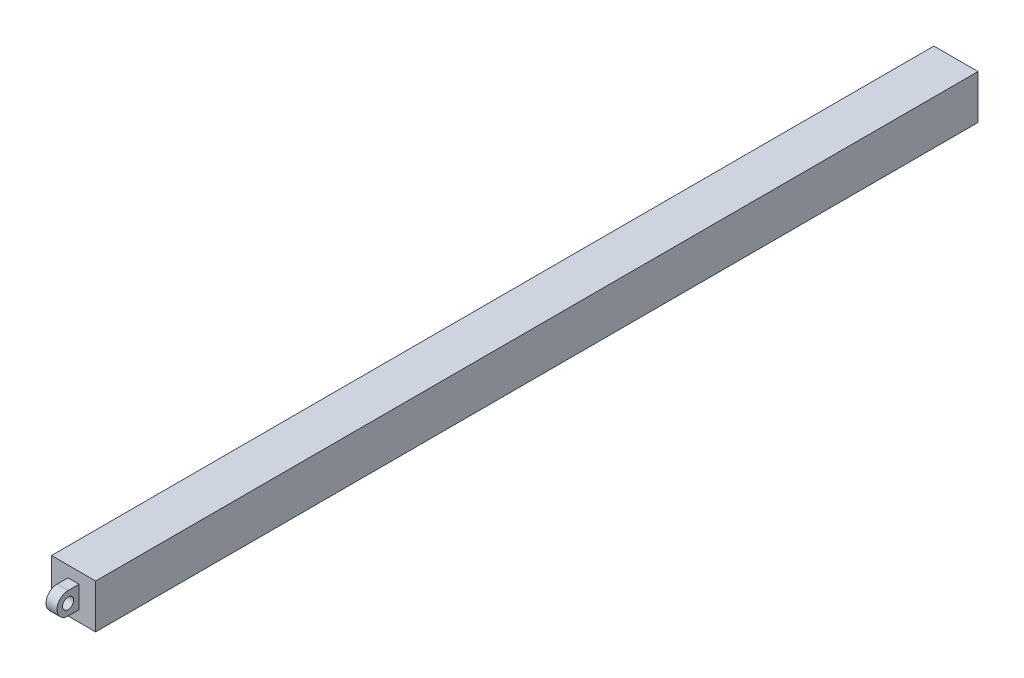
ISO-10303-21;
HEADER;
FILE_DESCRIPTION(('STEP AP214'),'2;1');
FILE_NAME('part.step','',(''),(''),'','','');
FILE_SCHEMA(('AUTOMOTIVE_DESIGN { 1 0 10303 214 1 1 1 1 }'));
ENDSEC;
DATA;
#1=APPLICATION_CONTEXT('core data for automotive mechanical design processes');
#2=APPLICATION_PROTOCOL_DEFINITION('international standard','automotive_design',2000,#1);
#3=PRODUCT_CONTEXT('',#1,'mechanical');
#4=PRODUCT('Part','Part','',(#3));
#5=PRODUCT_RELATED_PRODUCT_CATEGORY('part','',(#4));
#6=PRODUCT_DEFINITION_FORMATION('','',#4);
#7=PRODUCT_DEFINITION_CONTEXT('part definition',#1,'design');
#8=PRODUCT_DEFINITION('design','',#6,#7);
#9=PRODUCT_DEFINITION_SHAPE('','',#8);
#10=(LENGTH_UNIT() NAMED_UNIT(*) SI_UNIT(.MILLI.,.METRE.));
#11=(NAMED_UNIT(*) PLANE_ANGLE_UNIT() SI_UNIT($,.RADIAN.));
#12=(NAMED_UNIT(*) SI_UNIT($,.STERADIAN.) SOLID_ANGLE_UNIT());
#13=UNCERTAINTY_MEASURE_WITH_UNIT(LENGTH_MEASURE(1.E-05),#10,'distance_accuracy_value','');
#14=(GEOMETRIC_REPRESENTATION_CONTEXT(3) GLOBAL_UNCERTAINTY_ASSIGNED_CONTEXT((#13)) GLOBAL_UNIT_ASSIGNED_CONTEXT((#10,
#11,#12)) REPRESENTATION_CONTEXT('',''));
#15=CARTESIAN_POINT('',(0.,0.,0.));
#16=DIRECTION('',(0.,0.,1.));
#17=DIRECTION('',(1.,0.,0.));
#18=AXIS2_PLACEMENT_3D('',#15,#16,#17);
#19=CARTESIAN_POINT('',(5.,5.00000000000002,100.));
#20=DIRECTION('',(0.,0.,-1.));
#21=DIRECTION('',(-1.,0.,0.));
#22=AXIS2_PLACEMENT_3D('',#19,#20,#21);
#23=PLANE('',#22);
#24=DIRECTION('',(0.,-1.,0.));
#25=VECTOR('',#24,1.);
#26=CARTESIAN_POINT('',(-5.,5.00000000000002,100.));
#27=LINE('',#26,#25);
#28=CARTESIAN_POINT('',(-5.,5.00000000000002,100.));
#29=VERTEX_POINT('',#28);
#30=CARTESIAN_POINT('',(-5.,-5.00000000000002,100.));
#31=VERTEX_POINT('',#30);
#32=EDGE_CURVE('E121',#29,#31,#27,.T.);
#33=ORIENTED_EDGE('',*,*,#32,.T.);
#34=DIRECTION('',(-1.,0.,0.));
#35=VECTOR('',#34,1.);
#36=CARTESIAN_POINT('',(5.,-5.00000000000002,100.));
#37=LINE('',#36,#35);
#38=CARTESIAN_POINT('',(5.,-5.00000000000002,100.));
#39=VERTEX_POINT('',#38);
#40=EDGE_CURVE('E11',#39,#31,#37,.T.);
#41=ORIENTED_EDGE('',*,*,#40,.F.);
#42=DIRECTION('',(0.,-1.,0.));
#43=VECTOR('',#42,1.);
#44=CARTESIAN_POINT('',(5.,5.00000000000002,100.));
#45=LINE('',#44,#43);
#46=CARTESIAN_POINT('',(5.,5.00000000000002,100.));
#47=VERTEX_POINT('',#46);
#48=EDGE_CURVE('E130',#47,#39,#45,.T.);
#49=ORIENTED_EDGE('',*,*,#48,.F.);
#50=DIRECTION('',(-1.,0.,0.));
#51=VECTOR('',#50,1.);
#52=CARTESIAN_POINT('',(5.,5.00000000000002,100.));
#53=LINE('',#52,#51);
#54=EDGE_CURVE('E139',#47,#29,#53,.T.);
#55=ORIENTED_EDGE('',*,*,#54,.T.);
#56=EDGE_LOOP('',(#33,#41,#49,#55));
#57=FACE_BOUND('',#56,.T.);
#58=DIRECTION('',(-1.,0.,0.));
#59=VECTOR('',#58,1.);
#60=CARTESIAN_POINT('',(1.25,-2.50000000000001,100.));
#61=LINE('',#60,#59);
#62=CARTESIAN_POINT('',(1.25,-2.50000000000001,100.));
#63=VERTEX_POINT('',#62);
#64=CARTESIAN_POINT('',(-1.25,-2.50000000000001,100.));
#65=VERTEX_POINT('',#64);
#66=EDGE_CURVE('E56',#63,#65,#61,.T.);
#67=ORIENTED_EDGE('',*,*,#66,.T.);
#68=DIRECTION('',(0.,1.,0.));
#69=VECTOR('',#68,1.);
#70=CARTESIAN_POINT('',(-1.25,2.49999999999999,100.));
#71=LINE('',#70,#69);
#72=CARTESIAN_POINT('',(-1.25,2.49999999999999,100.));
#73=VERTEX_POINT('',#72);
#74=EDGE_CURVE('E220',#65,#73,#71,.T.);
#75=ORIENTED_EDGE('',*,*,#74,.T.);
#76=DIRECTION('',(-1.,0.,0.));
#77=VECTOR('',#76,1.);
#78=CARTESIAN_POINT('',(1.25,2.49999999999999,100.));
#79=LINE('',#78,#77);
#80=CARTESIAN_POINT('',(1.25,2.49999999999999,100.));
#81=VERTEX_POINT('',#80);
#82=EDGE_CURVE('E126',#81,#73,#79,.T.);
#83=ORIENTED_EDGE('',*,*,#82,.F.);
#84=DIRECTION('',(0.,1.,0.));
#85=VECTOR('',#84,1.);
#86=CARTESIAN_POINT('',(1.25,2.49999999999999,100.));
#87=LINE('',#86,#85);
#88=EDGE_CURVE('E51',#63,#81,#87,.T.);
#89=ORIENTED_EDGE('',*,*,#88,.F.);
#90=EDGE_LOOP('',(#67,#75,#83,#89));
#91=FACE_BOUND('',#90,.T.);
#92=ADVANCED_FACE('F37',(#57,#91),#23,.F.);
#93=CARTESIAN_POINT('',(5.,-5.00000000000002,100.));
#94=DIRECTION('',(0.,1.,0.));
#95=DIRECTION('',(0.,0.,1.));
#96=AXIS2_PLACEMENT_3D('',#93,#94,#95);
#97=PLANE('',#96);
#98=DIRECTION('',(0.,0.,-1.));
#99=VECTOR('',#98,1.);
#100=CARTESIAN_POINT('',(-5.,-5.00000000000002,100.));
#101=LINE('',#100,#99);
#102=CARTESIAN_POINT('',(-5.,-5.,-100.));
#103=VERTEX_POINT('',#102);
#104=EDGE_CURVE('E124',#31,#103,#101,.T.);
#105=ORIENTED_EDGE('',*,*,#104,.T.);
#106=DIRECTION('',(-1.,0.,0.));
#107=VECTOR('',#106,1.);
#108=CARTESIAN_POINT('',(5.,-5.,-100.));
#109=LINE('',#108,#107);
#110=CARTESIAN_POINT('',(5.,-5.,-100.));
#111=VERTEX_POINT('',#110);
#112=EDGE_CURVE('E44',#111,#103,#109,.T.);
#113=ORIENTED_EDGE('',*,*,#112,.F.);
#114=DIRECTION('',(0.,0.,-1.));
#115=VECTOR('',#114,1.);
#116=CARTESIAN_POINT('',(5.,-5.00000000000002,100.));
#117=LINE('',#116,#115);
#118=EDGE_CURVE('E133',#39,#111,#117,.T.);
#119=ORIENTED_EDGE('',*,*,#118,.F.);
#120=ORIENTED_EDGE('',*,*,#40,.T.);
#121=EDGE_LOOP('',(#105,#113,#119,#120));
#122=FACE_BOUND('',#121,.T.);
#123=ADVANCED_FACE('F170',(#122),#97,.F.);
#124=CARTESIAN_POINT('',(5.,5.,-100.));
#125=DIRECTION('',(0.,0.,1.));
#126=DIRECTION('',(1.,0.,0.));
#127=AXIS2_PLACEMENT_3D('',#124,#125,#126);
#128=PLANE('',#127);
#129=DIRECTION('',(0.,1.,0.));
#130=VECTOR('',#129,1.);
#131=CARTESIAN_POINT('',(-5.,5.,-100.));
#132=LINE('',#131,#130);
#133=CARTESIAN_POINT('',(-5.,5.,-100.));
#134=VERTEX_POINT('',#133);
#135=EDGE_CURVE('E142',#103,#134,#132,.T.);
#136=ORIENTED_EDGE('',*,*,#135,.T.);
#137=DIRECTION('',(-1.,0.,0.));
#138=VECTOR('',#137,1.);
#139=CARTESIAN_POINT('',(5.,5.,-100.));
#140=LINE('',#139,#138);
#141=CARTESIAN_POINT('',(5.,5.,-100.));
#142=VERTEX_POINT('',#141);
#143=EDGE_CURVE('E147',#142,#134,#140,.T.);
#144=ORIENTED_EDGE('',*,*,#143,.F.);
#145=DIRECTION('',(0.,1.,0.));
#146=VECTOR('',#145,1.);
#147=CARTESIAN_POINT('',(5.,5.,-100.));
#148=LINE('',#147,#146);
#149=EDGE_CURVE('E136',#111,#142,#148,.T.);
#150=ORIENTED_EDGE('',*,*,#149,.F.);
#151=ORIENTED_EDGE('',*,*,#112,.T.);
#152=EDGE_LOOP('',(#136,#144,#150,#151));
#153=FACE_BOUND('',#152,.T.);
#154=ADVANCED_FACE('F154',(#153),#128,.F.);
#155=CARTESIAN_POINT('',(5.,5.00000000000002,100.));
#156=DIRECTION('',(0.,-1.,0.));
#157=DIRECTION('',(0.,0.,-1.));
#158=AXIS2_PLACEMENT_3D('',#155,#156,#157);
#159=PLANE('',#158);
#160=DIRECTION('',(0.,0.,1.));
#161=VECTOR('',#160,1.);
#162=CARTESIAN_POINT('',(-5.,5.00000000000002,100.));
#163=LINE('',#162,#161);
#164=EDGE_CURVE('E134',#134,#29,#163,.T.);
#165=ORIENTED_EDGE('',*,*,#164,.T.);
#166=ORIENTED_EDGE('',*,*,#54,.F.);
#167=DIRECTION('',(0.,0.,1.));
#168=VECTOR('',#167,1.);
#169=CARTESIAN_POINT('',(5.,5.00000000000002,100.));
#170=LINE('',#169,#168);
#171=EDGE_CURVE('E138',#142,#47,#170,.T.);
#172=ORIENTED_EDGE('',*,*,#171,.F.);
#173=ORIENTED_EDGE('',*,*,#143,.T.);
#174=EDGE_LOOP('',(#165,#166,#172,#173));
#175=FACE_BOUND('',#174,.T.);
#176=ADVANCED_FACE('F163',(#175),#159,.F.);
#177=CARTESIAN_POINT('',(5.,0.,0.));
#178=DIRECTION('',(1.,0.,0.));
#179=DIRECTION('',(0.,0.,-1.));
#180=AXIS2_PLACEMENT_3D('',#177,#178,#179);
#181=PLANE('',#180);
#182=ORIENTED_EDGE('',*,*,#48,.T.);
#183=ORIENTED_EDGE('',*,*,#118,.T.);
#184=ORIENTED_EDGE('',*,*,#149,.T.);
#185=ORIENTED_EDGE('',*,*,#171,.T.);
#186=EDGE_LOOP('',(#182,#183,#184,#185));
#187=FACE_BOUND('',#186,.T.);
#188=ADVANCED_FACE('F169',(#187),#181,.T.);
#189=CARTESIAN_POINT('',(-5.,0.,0.));
#190=DIRECTION('',(1.,0.,0.));
#191=DIRECTION('',(0.,0.,-1.));
#192=AXIS2_PLACEMENT_3D('',#189,#190,#191);
#193=PLANE('',#192);
#194=ORIENTED_EDGE('',*,*,#32,.F.);
#195=ORIENTED_EDGE('',*,*,#164,.F.);
#196=ORIENTED_EDGE('',*,*,#135,.F.);
#197=ORIENTED_EDGE('',*,*,#104,.F.);
#198=EDGE_LOOP('',(#194,#195,#196,#197));
#199=FACE_BOUND('',#198,.T.);
#200=ADVANCED_FACE('F160',(#199),#193,.F.);
#201=CARTESIAN_POINT('',(1.25,0.,102.5));
#202=DIRECTION('',(1.,0.,0.));
#203=DIRECTION('',(0.,0.,-1.));
#204=AXIS2_PLACEMENT_3D('',#201,#202,#203);
#205=PLANE('',#204);
#206=CARTESIAN_POINT('',(1.25,0.,102.5));
#207=DIRECTION('',(1.,0.,0.));
#208=DIRECTION('',(0.,0.,-1.));
#209=AXIS2_PLACEMENT_3D('',#206,#207,#208);
#210=CIRCLE('',#209,2.5);
#211=CARTESIAN_POINT('',(1.25,2.5,102.5));
#212=VERTEX_POINT('',#211);
#213=CARTESIAN_POINT('',(1.25,-2.5,102.5));
#214=VERTEX_POINT('',#213);
#215=EDGE_CURVE('E106',#212,#214,#210,.T.);
#216=ORIENTED_EDGE('',*,*,#215,.T.);
#217=DIRECTION('',(0.,0.,-1.));
#218=VECTOR('',#217,1.);
#219=CARTESIAN_POINT('',(1.25,-2.5,102.5));
#220=LINE('',#219,#218);
#221=EDGE_CURVE('E99',#214,#63,#220,.T.);
#222=ORIENTED_EDGE('',*,*,#221,.T.);
#223=ORIENTED_EDGE('',*,*,#88,.T.);
#224=DIRECTION('',(0.,0.,1.));
#225=VECTOR('',#224,1.);
#226=CARTESIAN_POINT('',(1.25,2.5,102.5));
#227=LINE('',#226,#225);
#228=EDGE_CURVE('E112',#81,#212,#227,.T.);
#229=ORIENTED_EDGE('',*,*,#228,.T.);
#230=EDGE_LOOP('',(#216,#222,#223,#229));
#231=FACE_BOUND('',#230,.T.);
#232=CARTESIAN_POINT('',(1.25,0.,102.5));
#233=DIRECTION('',(1.,0.,0.));
#234=DIRECTION('',(0.,0.,-1.));
#235=AXIS2_PLACEMENT_3D('',#232,#233,#234);
#236=CIRCLE('',#235,1.25);
#237=CARTESIAN_POINT('',(1.25,0.,101.25));
#238=VERTEX_POINT('',#237);
#239=EDGE_CURVE('E206',#238,#238,#236,.T.);
#240=ORIENTED_EDGE('',*,*,#239,.F.);
#241=EDGE_LOOP('',(#240));
#242=FACE_BOUND('',#241,.T.);
#243=ADVANCED_FACE('F109',(#231,#242),#205,.T.);
#244=CARTESIAN_POINT('',(-1.25,0.,102.5));
#245=DIRECTION('',(1.,0.,0.));
#246=DIRECTION('',(0.,0.,-1.));
#247=AXIS2_PLACEMENT_3D('',#244,#245,#246);
#248=PLANE('',#247);
#249=CARTESIAN_POINT('',(-1.25,0.,102.5));
#250=DIRECTION('',(1.,0.,0.));
#251=DIRECTION('',(0.,0.,-1.));
#252=AXIS2_PLACEMENT_3D('',#249,#250,#251);
#253=CIRCLE('',#252,2.5);
#254=CARTESIAN_POINT('',(-1.25,2.5,102.5));
#255=VERTEX_POINT('',#254);
#256=CARTESIAN_POINT('',(-1.25,-2.5,102.5));
#257=VERTEX_POINT('',#256);
#258=EDGE_CURVE('E120',#255,#257,#253,.T.);
#259=ORIENTED_EDGE('',*,*,#258,.F.);
#260=DIRECTION('',(0.,0.,1.));
#261=VECTOR('',#260,1.);
#262=CARTESIAN_POINT('',(-1.25,2.5,102.5));
#263=LINE('',#262,#261);
#264=EDGE_CURVE('E116',#73,#255,#263,.T.);
#265=ORIENTED_EDGE('',*,*,#264,.F.);
#266=ORIENTED_EDGE('',*,*,#74,.F.);
#267=DIRECTION('',(0.,0.,-1.));
#268=VECTOR('',#267,1.);
#269=CARTESIAN_POINT('',(-1.25,-2.5,102.5));
#270=LINE('',#269,#268);
#271=EDGE_CURVE('E218',#257,#65,#270,.T.);
#272=ORIENTED_EDGE('',*,*,#271,.F.);
#273=EDGE_LOOP('',(#259,#265,#266,#272));
#274=FACE_BOUND('',#273,.T.);
#275=CARTESIAN_POINT('',(-1.25,0.,102.5));
#276=DIRECTION('',(1.,0.,0.));
#277=DIRECTION('',(0.,0.,-1.));
#278=AXIS2_PLACEMENT_3D('',#275,#276,#277);
#279=CIRCLE('',#278,1.25);
#280=CARTESIAN_POINT('',(-1.25,0.,101.25));
#281=VERTEX_POINT('',#280);
#282=EDGE_CURVE('E209',#281,#281,#279,.T.);
#283=ORIENTED_EDGE('',*,*,#282,.T.);
#284=EDGE_LOOP('',(#283));
#285=FACE_BOUND('',#284,.T.);
#286=ADVANCED_FACE('F186',(#274,#285),#248,.F.);
#287=CARTESIAN_POINT('',(1.25,0.,102.5));
#288=DIRECTION('',(-1.,0.,0.));
#289=DIRECTION('',(0.,0.,1.));
#290=AXIS2_PLACEMENT_3D('',#287,#288,#289);
#291=CYLINDRICAL_SURFACE('',#290,2.5);
#292=ORIENTED_EDGE('',*,*,#258,.T.);
#293=DIRECTION('',(-1.,0.,0.));
#294=VECTOR('',#293,1.);
#295=CARTESIAN_POINT('',(1.25,-2.5,102.5));
#296=LINE('',#295,#294);
#297=EDGE_CURVE('E103',#214,#257,#296,.T.);
#298=ORIENTED_EDGE('',*,*,#297,.F.);
#299=ORIENTED_EDGE('',*,*,#215,.F.);
#300=DIRECTION('',(-1.,0.,0.));
#301=VECTOR('',#300,1.);
#302=CARTESIAN_POINT('',(1.25,2.5,102.5));
#303=LINE('',#302,#301);
#304=EDGE_CURVE('E216',#212,#255,#303,.T.);
#305=ORIENTED_EDGE('',*,*,#304,.T.);
#306=EDGE_LOOP('',(#292,#298,#299,#305));
#307=FACE_BOUND('',#306,.T.);
#308=ADVANCED_FACE('F118',(#307),#291,.T.);
#309=CARTESIAN_POINT('',(1.25,-2.5,102.5));
#310=DIRECTION('',(0.,1.,0.));
#311=DIRECTION('',(0.,0.,1.));
#312=AXIS2_PLACEMENT_3D('',#309,#310,#311);
#313=PLANE('',#312);
#314=ORIENTED_EDGE('',*,*,#271,.T.);
#315=ORIENTED_EDGE('',*,*,#66,.F.);
#316=ORIENTED_EDGE('',*,*,#221,.F.);
#317=ORIENTED_EDGE('',*,*,#297,.T.);
#318=EDGE_LOOP('',(#314,#315,#316,#317));
#319=FACE_BOUND('',#318,.T.);
#320=ADVANCED_FACE('F101',(#319),#313,.F.);
#321=CARTESIAN_POINT('',(1.25,2.5,102.5));
#322=DIRECTION('',(0.,-1.,0.));
#323=DIRECTION('',(0.,0.,-1.));
#324=AXIS2_PLACEMENT_3D('',#321,#322,#323);
#325=PLANE('',#324);
#326=ORIENTED_EDGE('',*,*,#264,.T.);
#327=ORIENTED_EDGE('',*,*,#304,.F.);
#328=ORIENTED_EDGE('',*,*,#228,.F.);
#329=ORIENTED_EDGE('',*,*,#82,.T.);
#330=EDGE_LOOP('',(#326,#327,#328,#329));
#331=FACE_BOUND('',#330,.T.);
#332=ADVANCED_FACE('F189',(#331),#325,.F.);
#333=CARTESIAN_POINT('',(1.25,0.,102.5));
#334=DIRECTION('',(-1.,0.,0.));
#335=DIRECTION('',(0.,0.,1.));
#336=AXIS2_PLACEMENT_3D('',#333,#334,#335);
#337=CYLINDRICAL_SURFACE('',#336,1.25);
#338=ORIENTED_EDGE('',*,*,#239,.T.);
#339=EDGE_LOOP('',(#338));
#340=FACE_BOUND('',#339,.T.);
#341=ORIENTED_EDGE('',*,*,#282,.F.);
#342=EDGE_LOOP('',(#341));
#343=FACE_BOUND('',#342,.T.);
#344=ADVANCED_FACE('F192',(#340,#343),#337,.F.);
#345=CLOSED_SHELL('',(#92,#123,#154,#176,#188,#200,#243,#286,#308,#320,#332,#344));
#346=MANIFOLD_SOLID_BREP('B2',#345);
#347=ADVANCED_BREP_SHAPE_REPRESENTATION('',(#18,#346),#14);
#348=SHAPE_DEFINITION_REPRESENTATION(#9,#347);
ENDSEC;
END-ISO-10303-21;
